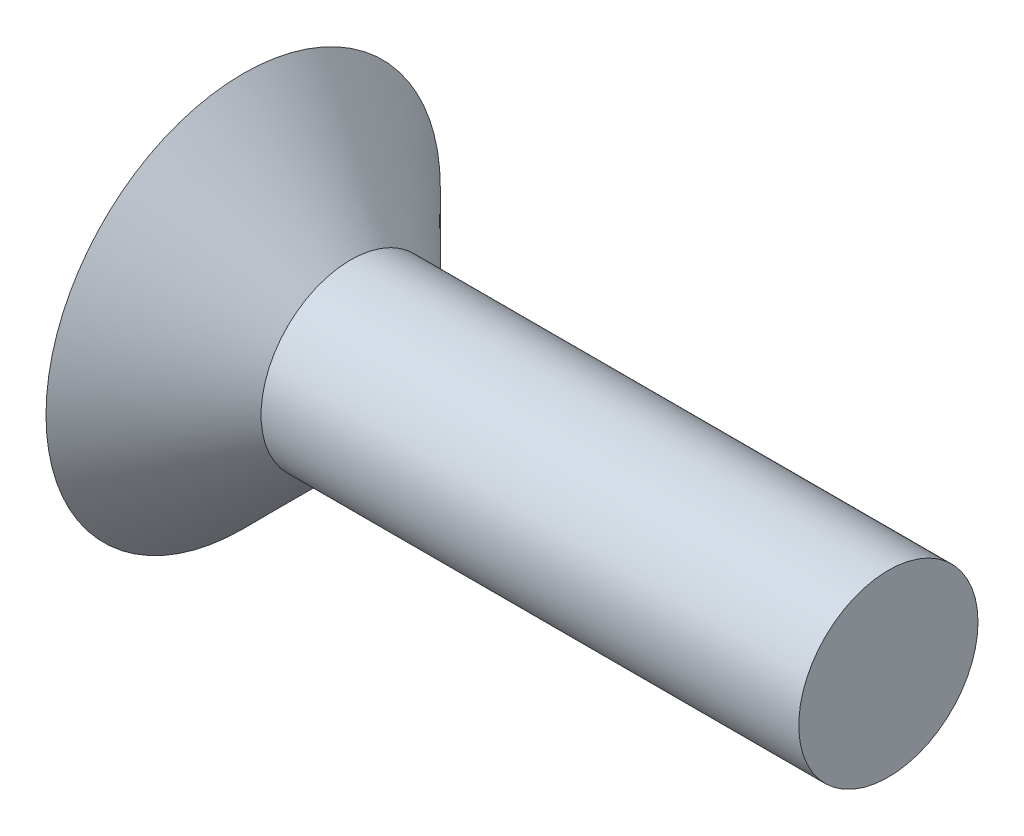
ISO-10303-21;
HEADER;
FILE_DESCRIPTION(('STEP AP214'),'2;1');
FILE_NAME('part.step','',(''),(''),'','','');
FILE_SCHEMA(('AUTOMOTIVE_DESIGN { 1 0 10303 214 1 1 1 1 }'));
ENDSEC;
DATA;
#1=APPLICATION_CONTEXT('core data for automotive mechanical design processes');
#2=APPLICATION_PROTOCOL_DEFINITION('international standard','automotive_design',2000,#1);
#3=PRODUCT_CONTEXT('',#1,'mechanical');
#4=PRODUCT('Part','Part','',(#3));
#5=PRODUCT_RELATED_PRODUCT_CATEGORY('part','',(#4));
#6=PRODUCT_DEFINITION_FORMATION('','',#4);
#7=PRODUCT_DEFINITION_CONTEXT('part definition',#1,'design');
#8=PRODUCT_DEFINITION('design','',#6,#7);
#9=PRODUCT_DEFINITION_SHAPE('','',#8);
#10=(LENGTH_UNIT() NAMED_UNIT(*) SI_UNIT(.MILLI.,.METRE.));
#11=(NAMED_UNIT(*) PLANE_ANGLE_UNIT() SI_UNIT($,.RADIAN.));
#12=(NAMED_UNIT(*) SI_UNIT($,.STERADIAN.) SOLID_ANGLE_UNIT());
#13=UNCERTAINTY_MEASURE_WITH_UNIT(LENGTH_MEASURE(1.E-05),#10,'distance_accuracy_value','');
#14=(GEOMETRIC_REPRESENTATION_CONTEXT(3) GLOBAL_UNCERTAINTY_ASSIGNED_CONTEXT((#13)) GLOBAL_UNIT_ASSIGNED_CONTEXT((#10,
#11,#12)) REPRESENTATION_CONTEXT('',''));
#15=CARTESIAN_POINT('',(0.,0.,0.));
#16=DIRECTION('',(0.,0.,1.));
#17=DIRECTION('',(1.,0.,0.));
#18=AXIS2_PLACEMENT_3D('',#15,#16,#17);
#19=CARTESIAN_POINT('',(0.,0.,0.));
#20=DIRECTION('',(-1.,0.,0.));
#21=DIRECTION('',(0.,0.,1.));
#22=AXIS2_PLACEMENT_3D('',#19,#20,#21);
#23=PLANE('',#22);
#24=CARTESIAN_POINT('',(0.,0.,0.));
#25=DIRECTION('',(1.,0.,0.));
#26=DIRECTION('',(0.,0.,-1.));
#27=AXIS2_PLACEMENT_3D('',#24,#25,#26);
#28=CIRCLE('',#27,2.19999999999997);
#29=CARTESIAN_POINT('',(0.,0.,-2.19999999999997));
#30=VERTEX_POINT('',#29);
#31=EDGE_CURVE('E10',#30,#30,#28,.T.);
#32=ORIENTED_EDGE('',*,*,#31,.F.);
#33=EDGE_LOOP('',(#32));
#34=FACE_BOUND('',#33,.T.);
#35=ADVANCED_FACE('F35',(#34),#23,.T.);
#36=CARTESIAN_POINT('',(1.2,0.,0.));
#37=DIRECTION('',(-1.,0.,0.));
#38=DIRECTION('',(0.,0.,1.));
#39=AXIS2_PLACEMENT_3D('',#36,#37,#38);
#40=CONICAL_SURFACE('',#39,1.,0.785398163397436);
#41=ORIENTED_EDGE('',*,*,#31,.T.);
#42=EDGE_LOOP('',(#41));
#43=FACE_BOUND('',#42,.T.);
#44=CARTESIAN_POINT('',(1.2,0.,0.));
#45=DIRECTION('',(1.,0.,0.));
#46=DIRECTION('',(0.,0.,-1.));
#47=AXIS2_PLACEMENT_3D('',#44,#45,#46);
#48=CIRCLE('',#47,1.);
#49=CARTESIAN_POINT('',(1.2,0.,-1.));
#50=VERTEX_POINT('',#49);
#51=EDGE_CURVE('E41',#50,#50,#48,.T.);
#52=ORIENTED_EDGE('',*,*,#51,.F.);
#53=EDGE_LOOP('',(#52));
#54=FACE_BOUND('',#53,.T.);
#55=ADVANCED_FACE('F56',(#43,#54),#40,.T.);
#56=CARTESIAN_POINT('',(0.,0.,0.));
#57=DIRECTION('',(1.,0.,0.));
#58=DIRECTION('',(0.,0.,-1.));
#59=AXIS2_PLACEMENT_3D('',#56,#57,#58);
#60=CYLINDRICAL_SURFACE('',#59,1.);
#61=ORIENTED_EDGE('',*,*,#51,.T.);
#62=EDGE_LOOP('',(#61));
#63=FACE_BOUND('',#62,.T.);
#64=CARTESIAN_POINT('',(7.2,0.,0.));
#65=DIRECTION('',(1.,0.,0.));
#66=DIRECTION('',(0.,0.,-1.));
#67=AXIS2_PLACEMENT_3D('',#64,#65,#66);
#68=CIRCLE('',#67,1.);
#69=CARTESIAN_POINT('',(7.2,0.,-1.));
#70=VERTEX_POINT('',#69);
#71=EDGE_CURVE('E45',#70,#70,#68,.T.);
#72=ORIENTED_EDGE('',*,*,#71,.F.);
#73=EDGE_LOOP('',(#72));
#74=FACE_BOUND('',#73,.T.);
#75=ADVANCED_FACE('F54',(#63,#74),#60,.T.);
#76=CARTESIAN_POINT('',(7.2,1.,0.));
#77=DIRECTION('',(1.,0.,0.));
#78=DIRECTION('',(0.,0.,-1.));
#79=AXIS2_PLACEMENT_3D('',#76,#77,#78);
#80=PLANE('',#79);
#81=ORIENTED_EDGE('',*,*,#71,.T.);
#82=EDGE_LOOP('',(#81));
#83=FACE_BOUND('',#82,.T.);
#84=ADVANCED_FACE('F52',(#83),#80,.T.);
#85=CLOSED_SHELL('',(#35,#55,#75,#84));
#86=MANIFOLD_SOLID_BREP('B2',#85);
#87=ADVANCED_BREP_SHAPE_REPRESENTATION('',(#18,#86),#14);
#88=SHAPE_DEFINITION_REPRESENTATION(#9,#87);
ENDSEC;
END-ISO-10303-21;
